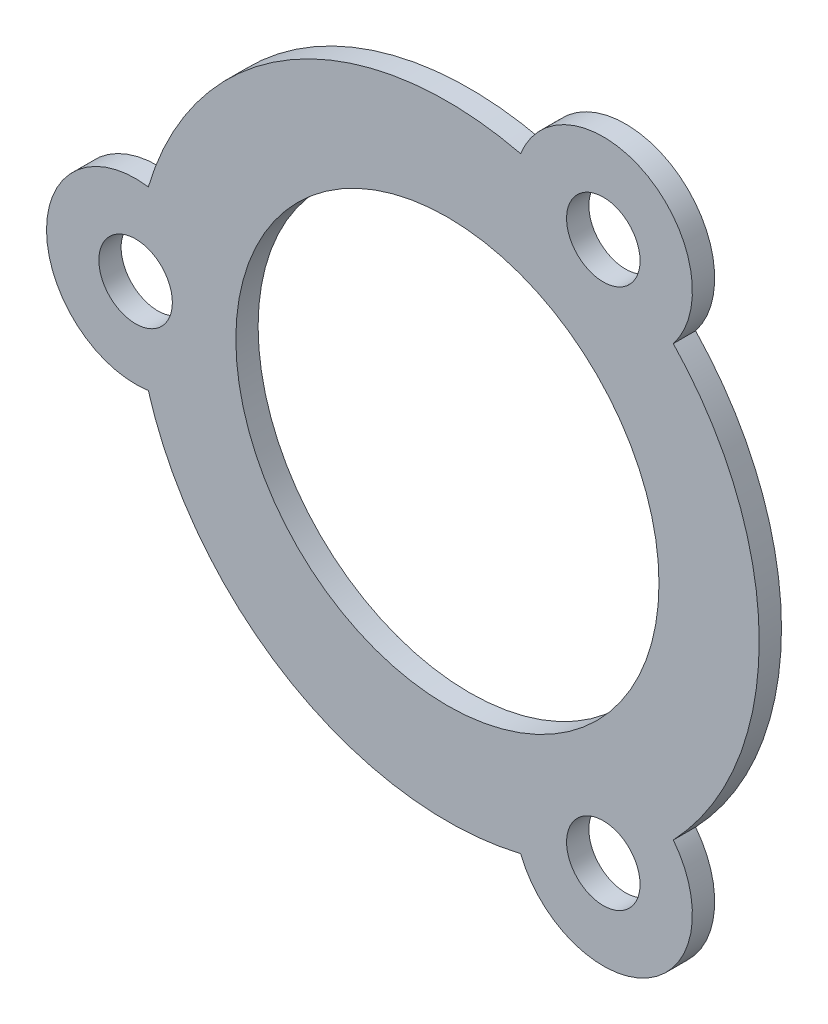
ISO-10303-21;
HEADER;
FILE_DESCRIPTION(('STEP AP214'),'2;1');
FILE_NAME('part.step','',(''),(''),'','','');
FILE_SCHEMA(('AUTOMOTIVE_DESIGN { 1 0 10303 214 1 1 1 1 }'));
ENDSEC;
DATA;
#1=APPLICATION_CONTEXT('core data for automotive mechanical design processes');
#2=APPLICATION_PROTOCOL_DEFINITION('international standard','automotive_design',2000,#1);
#3=PRODUCT_CONTEXT('',#1,'mechanical');
#4=PRODUCT('Part','Part','',(#3));
#5=PRODUCT_RELATED_PRODUCT_CATEGORY('part','',(#4));
#6=PRODUCT_DEFINITION_FORMATION('','',#4);
#7=PRODUCT_DEFINITION_CONTEXT('part definition',#1,'design');
#8=PRODUCT_DEFINITION('design','',#6,#7);
#9=PRODUCT_DEFINITION_SHAPE('','',#8);
#10=(LENGTH_UNIT() NAMED_UNIT(*) SI_UNIT(.MILLI.,.METRE.));
#11=(NAMED_UNIT(*) PLANE_ANGLE_UNIT() SI_UNIT($,.RADIAN.));
#12=(NAMED_UNIT(*) SI_UNIT($,.STERADIAN.) SOLID_ANGLE_UNIT());
#13=UNCERTAINTY_MEASURE_WITH_UNIT(LENGTH_MEASURE(1.E-05),#10,'distance_accuracy_value','');
#14=(GEOMETRIC_REPRESENTATION_CONTEXT(3) GLOBAL_UNCERTAINTY_ASSIGNED_CONTEXT((#13)) GLOBAL_UNIT_ASSIGNED_CONTEXT((#10,
#11,#12)) REPRESENTATION_CONTEXT('',''));
#15=CARTESIAN_POINT('',(0.,0.,0.));
#16=DIRECTION('',(0.,0.,1.));
#17=DIRECTION('',(1.,0.,0.));
#18=AXIS2_PLACEMENT_3D('',#15,#16,#17);
#19=CARTESIAN_POINT('',(3.50000000000007,6.06217782648983,1.));
#20=DIRECTION('',(0.,0.,1.));
#21=DIRECTION('',(1.,0.,0.));
#22=AXIS2_PLACEMENT_3D('',#19,#20,#21);
#23=PLANE('',#22);
#24=CARTESIAN_POINT('',(-14.0000000000001,-1.48579065717414E-12,1.));
#25=DIRECTION('',(0.,0.,1.));
#26=DIRECTION('',(1.,0.,0.));
#27=AXIS2_PLACEMENT_3D('',#24,#25,#26);
#28=CIRCLE('',#27,1.65);
#29=CARTESIAN_POINT('',(-12.3500000000001,-1.48579065717414E-12,1.));
#30=VERTEX_POINT('',#29);
#31=EDGE_CURVE('E193',#30,#30,#28,.T.);
#32=ORIENTED_EDGE('',*,*,#31,.F.);
#33=EDGE_LOOP('',(#32));
#34=FACE_BOUND('',#33,.T.);
#35=CARTESIAN_POINT('',(7.00000000000026,12.1243556529807,1.));
#36=DIRECTION('',(0.,0.,1.));
#37=DIRECTION('',(1.,0.,0.));
#38=AXIS2_PLACEMENT_3D('',#35,#36,#37);
#39=CIRCLE('',#38,1.65);
#40=CARTESIAN_POINT('',(8.65000000000026,12.1243556529807,1.));
#41=VERTEX_POINT('',#40);
#42=EDGE_CURVE('E126',#41,#41,#39,.T.);
#43=ORIENTED_EDGE('',*,*,#42,.F.);
#44=EDGE_LOOP('',(#43));
#45=FACE_BOUND('',#44,.T.);
#46=CARTESIAN_POINT('',(-1.15281465963681E-13,-1.07698597882384E-12,1.));
#47=DIRECTION('',(0.,0.,1.));
#48=DIRECTION('',(1.,0.,0.));
#49=AXIS2_PLACEMENT_3D('',#46,#47,#48);
#50=CIRCLE('',#49,14.);
#51=CARTESIAN_POINT('',(10.1428571428569,-9.64999735645642,1.));
#52=VERTEX_POINT('',#51);
#53=CARTESIAN_POINT('',(10.1428571428574,9.64999735645374,1.));
#54=VERTEX_POINT('',#53);
#55=EDGE_CURVE('E133',#52,#54,#50,.T.);
#56=ORIENTED_EDGE('',*,*,#55,.T.);
#57=CARTESIAN_POINT('',(7.00000000000026,12.1243556529807,1.));
#58=DIRECTION('',(0.,0.,1.));
#59=DIRECTION('',(1.,0.,0.));
#60=AXIS2_PLACEMENT_3D('',#57,#58,#59);
#61=CIRCLE('',#60,4.);
#62=CARTESIAN_POINT('',(3.28571428571463,13.6089706308971,1.));
#63=VERTEX_POINT('',#62);
#64=EDGE_CURVE('E91',#54,#63,#61,.T.);
#65=ORIENTED_EDGE('',*,*,#64,.T.);
#66=CARTESIAN_POINT('',(-1.15281465963681E-13,-1.07698597882384E-12,1.));
#67=DIRECTION('',(0.,0.,1.));
#68=DIRECTION('',(1.,0.,0.));
#69=AXIS2_PLACEMENT_3D('',#66,#67,#68);
#70=CIRCLE('',#69,14.);
#71=CARTESIAN_POINT('',(-13.4285714285717,3.95897327444167,1.));
#72=VERTEX_POINT('',#71);
#73=EDGE_CURVE('E104',#63,#72,#70,.T.);
#74=ORIENTED_EDGE('',*,*,#73,.T.);
#75=CARTESIAN_POINT('',(-14.0000000000001,-1.48599188509735E-12,1.));
#76=DIRECTION('',(0.,0.,1.));
#77=DIRECTION('',(1.,0.,0.));
#78=AXIS2_PLACEMENT_3D('',#75,#76,#77);
#79=CIRCLE('',#78,4.);
#80=CARTESIAN_POINT('',(-13.4285714285714,-3.95897327444461,1.));
#81=VERTEX_POINT('',#80);
#82=EDGE_CURVE('E98',#72,#81,#79,.T.);
#83=ORIENTED_EDGE('',*,*,#82,.T.);
#84=CARTESIAN_POINT('',(-1.15281465963681E-13,-1.07698597882384E-12,1.));
#85=DIRECTION('',(0.,0.,1.));
#86=DIRECTION('',(1.,0.,0.));
#87=AXIS2_PLACEMENT_3D('',#84,#85,#86);
#88=CIRCLE('',#87,14.);
#89=CARTESIAN_POINT('',(3.28571428571418,-13.6089706308994,1.));
#90=VERTEX_POINT('',#89);
#91=EDGE_CURVE('E102',#81,#90,#88,.T.);
#92=ORIENTED_EDGE('',*,*,#91,.T.);
#93=CARTESIAN_POINT('',(7.00000000000021,-12.124355652984,1.));
#94=DIRECTION('',(0.,0.,1.));
#95=DIRECTION('',(1.,0.,0.));
#96=AXIS2_PLACEMENT_3D('',#93,#94,#95);
#97=CIRCLE('',#96,4.);
#98=EDGE_CURVE('E54',#90,#52,#97,.T.);
#99=ORIENTED_EDGE('',*,*,#98,.T.);
#100=EDGE_LOOP('',(#56,#65,#74,#83,#92,#99));
#101=FACE_BOUND('',#100,.T.);
#102=CARTESIAN_POINT('',(7.00000000000021,-12.124355652984,1.));
#103=DIRECTION('',(0.,0.,1.));
#104=DIRECTION('',(1.,0.,0.));
#105=AXIS2_PLACEMENT_3D('',#102,#103,#104);
#106=CIRCLE('',#105,1.65);
#107=CARTESIAN_POINT('',(8.65000000000021,-12.124355652984,1.));
#108=VERTEX_POINT('',#107);
#109=EDGE_CURVE('E199',#108,#108,#106,.T.);
#110=ORIENTED_EDGE('',*,*,#109,.F.);
#111=EDGE_LOOP('',(#110));
#112=FACE_BOUND('',#111,.T.);
#113=CARTESIAN_POINT('',(-1.15975355354071E-13,-1.07587575579922E-12,1.));
#114=DIRECTION('',(0.,0.,1.));
#115=DIRECTION('',(1.,0.,0.));
#116=AXIS2_PLACEMENT_3D('',#113,#114,#115);
#117=CIRCLE('',#116,9.5);
#118=CARTESIAN_POINT('',(9.49999999999988,-1.07587575579922E-12,1.));
#119=VERTEX_POINT('',#118);
#120=EDGE_CURVE('E184',#119,#119,#117,.T.);
#121=ORIENTED_EDGE('',*,*,#120,.F.);
#122=EDGE_LOOP('',(#121));
#123=FACE_BOUND('',#122,.T.);
#124=ADVANCED_FACE('F37',(#34,#45,#101,#112,#123),#23,.T.);
#125=CARTESIAN_POINT('',(3.50000000000007,6.06217782648983,0.));
#126=DIRECTION('',(0.,0.,1.));
#127=DIRECTION('',(1.,0.,0.));
#128=AXIS2_PLACEMENT_3D('',#125,#126,#127);
#129=PLANE('',#128);
#130=CARTESIAN_POINT('',(-1.15281465963681E-13,-1.07698597882384E-12,0.));
#131=DIRECTION('',(0.,0.,1.));
#132=DIRECTION('',(1.,0.,0.));
#133=AXIS2_PLACEMENT_3D('',#130,#131,#132);
#134=CIRCLE('',#133,14.);
#135=CARTESIAN_POINT('',(10.1428571428569,-9.64999735645642,0.));
#136=VERTEX_POINT('',#135);
#137=CARTESIAN_POINT('',(10.1428571428574,9.64999735645374,0.));
#138=VERTEX_POINT('',#137);
#139=EDGE_CURVE('E122',#136,#138,#134,.T.);
#140=ORIENTED_EDGE('',*,*,#139,.F.);
#141=CARTESIAN_POINT('',(7.00000000000021,-12.124355652984,0.));
#142=DIRECTION('',(0.,0.,1.));
#143=DIRECTION('',(1.,0.,0.));
#144=AXIS2_PLACEMENT_3D('',#141,#142,#143);
#145=CIRCLE('',#144,4.);
#146=CARTESIAN_POINT('',(3.28571428571418,-13.6089706308994,0.));
#147=VERTEX_POINT('',#146);
#148=EDGE_CURVE('E83',#147,#136,#145,.T.);
#149=ORIENTED_EDGE('',*,*,#148,.F.);
#150=CARTESIAN_POINT('',(-1.15281465963681E-13,-1.07698597882384E-12,0.));
#151=DIRECTION('',(0.,0.,1.));
#152=DIRECTION('',(1.,0.,0.));
#153=AXIS2_PLACEMENT_3D('',#150,#151,#152);
#154=CIRCLE('',#153,14.);
#155=CARTESIAN_POINT('',(-13.4285714285714,-3.95897327444461,0.));
#156=VERTEX_POINT('',#155);
#157=EDGE_CURVE('E77',#156,#147,#154,.T.);
#158=ORIENTED_EDGE('',*,*,#157,.F.);
#159=CARTESIAN_POINT('',(-14.0000000000001,-1.48599188509735E-12,0.));
#160=DIRECTION('',(0.,0.,1.));
#161=DIRECTION('',(1.,0.,0.));
#162=AXIS2_PLACEMENT_3D('',#159,#160,#161);
#163=CIRCLE('',#162,4.);
#164=CARTESIAN_POINT('',(-13.4285714285717,3.95897327444167,0.));
#165=VERTEX_POINT('',#164);
#166=EDGE_CURVE('E112',#165,#156,#163,.T.);
#167=ORIENTED_EDGE('',*,*,#166,.F.);
#168=CARTESIAN_POINT('',(-1.15281465963681E-13,-1.07698597882384E-12,0.));
#169=DIRECTION('',(0.,0.,1.));
#170=DIRECTION('',(1.,0.,0.));
#171=AXIS2_PLACEMENT_3D('',#168,#169,#170);
#172=CIRCLE('',#171,14.);
#173=CARTESIAN_POINT('',(3.28571428571463,13.6089706308971,0.));
#174=VERTEX_POINT('',#173);
#175=EDGE_CURVE('E128',#174,#165,#172,.T.);
#176=ORIENTED_EDGE('',*,*,#175,.F.);
#177=CARTESIAN_POINT('',(7.00000000000026,12.1243556529807,0.));
#178=DIRECTION('',(0.,0.,1.));
#179=DIRECTION('',(1.,0.,0.));
#180=AXIS2_PLACEMENT_3D('',#177,#178,#179);
#181=CIRCLE('',#180,4.);
#182=EDGE_CURVE('E125',#138,#174,#181,.T.);
#183=ORIENTED_EDGE('',*,*,#182,.F.);
#184=EDGE_LOOP('',(#140,#149,#158,#167,#176,#183));
#185=FACE_BOUND('',#184,.T.);
#186=CARTESIAN_POINT('',(7.00000000000026,12.1243556529807,0.));
#187=DIRECTION('',(0.,0.,1.));
#188=DIRECTION('',(1.,0.,0.));
#189=AXIS2_PLACEMENT_3D('',#186,#187,#188);
#190=CIRCLE('',#189,1.65);
#191=CARTESIAN_POINT('',(8.65000000000026,12.1243556529807,0.));
#192=VERTEX_POINT('',#191);
#193=EDGE_CURVE('E202',#192,#192,#190,.T.);
#194=ORIENTED_EDGE('',*,*,#193,.T.);
#195=EDGE_LOOP('',(#194));
#196=FACE_BOUND('',#195,.T.);
#197=CARTESIAN_POINT('',(7.00000000000021,-12.124355652984,0.));
#198=DIRECTION('',(0.,0.,1.));
#199=DIRECTION('',(1.,0.,0.));
#200=AXIS2_PLACEMENT_3D('',#197,#198,#199);
#201=CIRCLE('',#200,1.65);
#202=CARTESIAN_POINT('',(8.65000000000021,-12.124355652984,0.));
#203=VERTEX_POINT('',#202);
#204=EDGE_CURVE('E196',#203,#203,#201,.T.);
#205=ORIENTED_EDGE('',*,*,#204,.T.);
#206=EDGE_LOOP('',(#205));
#207=FACE_BOUND('',#206,.T.);
#208=CARTESIAN_POINT('',(-14.0000000000001,-1.48579065717414E-12,0.));
#209=DIRECTION('',(0.,0.,1.));
#210=DIRECTION('',(1.,0.,0.));
#211=AXIS2_PLACEMENT_3D('',#208,#209,#210);
#212=CIRCLE('',#211,1.65);
#213=CARTESIAN_POINT('',(-12.3500000000001,-1.48579065717414E-12,0.));
#214=VERTEX_POINT('',#213);
#215=EDGE_CURVE('E190',#214,#214,#212,.T.);
#216=ORIENTED_EDGE('',*,*,#215,.T.);
#217=EDGE_LOOP('',(#216));
#218=FACE_BOUND('',#217,.T.);
#219=CARTESIAN_POINT('',(-1.15975355354071E-13,-1.07587575579922E-12,0.));
#220=DIRECTION('',(0.,0.,1.));
#221=DIRECTION('',(1.,0.,0.));
#222=AXIS2_PLACEMENT_3D('',#219,#220,#221);
#223=CIRCLE('',#222,9.5);
#224=CARTESIAN_POINT('',(9.49999999999988,-1.07587575579922E-12,0.));
#225=VERTEX_POINT('',#224);
#226=EDGE_CURVE('E187',#225,#225,#223,.T.);
#227=ORIENTED_EDGE('',*,*,#226,.T.);
#228=EDGE_LOOP('',(#227));
#229=FACE_BOUND('',#228,.T.);
#230=ADVANCED_FACE('F142',(#185,#196,#207,#218,#229),#129,.F.);
#231=CARTESIAN_POINT('',(-1.15281465963681E-13,-1.07698597882384E-12,1.));
#232=DIRECTION('',(0.,0.,-1.));
#233=DIRECTION('',(-1.,0.,0.));
#234=AXIS2_PLACEMENT_3D('',#231,#232,#233);
#235=CYLINDRICAL_SURFACE('',#234,14.);
#236=ORIENTED_EDGE('',*,*,#139,.T.);
#237=DIRECTION('',(0.,0.,-1.));
#238=VECTOR('',#237,1.);
#239=CARTESIAN_POINT('',(10.1428571428574,9.64999735645374,1.));
#240=LINE('',#239,#238);
#241=EDGE_CURVE('E11',#54,#138,#240,.T.);
#242=ORIENTED_EDGE('',*,*,#241,.F.);
#243=ORIENTED_EDGE('',*,*,#55,.F.);
#244=DIRECTION('',(0.,0.,-1.));
#245=VECTOR('',#244,1.);
#246=CARTESIAN_POINT('',(10.1428571428569,-9.64999735645642,1.));
#247=LINE('',#246,#245);
#248=EDGE_CURVE('E118',#52,#136,#247,.T.);
#249=ORIENTED_EDGE('',*,*,#248,.T.);
#250=EDGE_LOOP('',(#236,#242,#243,#249));
#251=FACE_BOUND('',#250,.T.);
#252=ADVANCED_FACE('F39',(#251),#235,.T.);
#253=CARTESIAN_POINT('',(7.00000000000026,12.1243556529807,1.));
#254=DIRECTION('',(0.,0.,-1.));
#255=DIRECTION('',(-1.,0.,0.));
#256=AXIS2_PLACEMENT_3D('',#253,#254,#255);
#257=CYLINDRICAL_SURFACE('',#256,4.);
#258=ORIENTED_EDGE('',*,*,#182,.T.);
#259=DIRECTION('',(0.,0.,-1.));
#260=VECTOR('',#259,1.);
#261=CARTESIAN_POINT('',(3.28571428571463,13.6089706308971,1.));
#262=LINE('',#261,#260);
#263=EDGE_CURVE('E46',#63,#174,#262,.T.);
#264=ORIENTED_EDGE('',*,*,#263,.F.);
#265=ORIENTED_EDGE('',*,*,#64,.F.);
#266=ORIENTED_EDGE('',*,*,#241,.T.);
#267=EDGE_LOOP('',(#258,#264,#265,#266));
#268=FACE_BOUND('',#267,.T.);
#269=ADVANCED_FACE('F264',(#268),#257,.T.);
#270=CARTESIAN_POINT('',(-1.15281465963681E-13,-1.07698597882384E-12,1.));
#271=DIRECTION('',(0.,0.,-1.));
#272=DIRECTION('',(-1.,0.,0.));
#273=AXIS2_PLACEMENT_3D('',#270,#271,#272);
#274=CYLINDRICAL_SURFACE('',#273,14.);
#275=ORIENTED_EDGE('',*,*,#175,.T.);
#276=DIRECTION('',(0.,0.,-1.));
#277=VECTOR('',#276,1.);
#278=CARTESIAN_POINT('',(-13.4285714285717,3.95897327444167,1.));
#279=LINE('',#278,#277);
#280=EDGE_CURVE('E113',#72,#165,#279,.T.);
#281=ORIENTED_EDGE('',*,*,#280,.F.);
#282=ORIENTED_EDGE('',*,*,#73,.F.);
#283=ORIENTED_EDGE('',*,*,#263,.T.);
#284=EDGE_LOOP('',(#275,#281,#282,#283));
#285=FACE_BOUND('',#284,.T.);
#286=ADVANCED_FACE('F139',(#285),#274,.T.);
#287=CARTESIAN_POINT('',(-14.0000000000001,-1.48599188509735E-12,1.));
#288=DIRECTION('',(0.,0.,-1.));
#289=DIRECTION('',(-1.,0.,0.));
#290=AXIS2_PLACEMENT_3D('',#287,#288,#289);
#291=CYLINDRICAL_SURFACE('',#290,4.);
#292=ORIENTED_EDGE('',*,*,#166,.T.);
#293=DIRECTION('',(0.,0.,-1.));
#294=VECTOR('',#293,1.);
#295=CARTESIAN_POINT('',(-13.4285714285714,-3.95897327444461,1.));
#296=LINE('',#295,#294);
#297=EDGE_CURVE('E109',#81,#156,#296,.T.);
#298=ORIENTED_EDGE('',*,*,#297,.F.);
#299=ORIENTED_EDGE('',*,*,#82,.F.);
#300=ORIENTED_EDGE('',*,*,#280,.T.);
#301=EDGE_LOOP('',(#292,#298,#299,#300));
#302=FACE_BOUND('',#301,.T.);
#303=ADVANCED_FACE('F110',(#302),#291,.T.);
#304=CARTESIAN_POINT('',(-1.15281465963681E-13,-1.07698597882384E-12,1.));
#305=DIRECTION('',(0.,0.,-1.));
#306=DIRECTION('',(-1.,0.,0.));
#307=AXIS2_PLACEMENT_3D('',#304,#305,#306);
#308=CYLINDRICAL_SURFACE('',#307,14.);
#309=ORIENTED_EDGE('',*,*,#157,.T.);
#310=DIRECTION('',(0.,0.,-1.));
#311=VECTOR('',#310,1.);
#312=CARTESIAN_POINT('',(3.28571428571418,-13.6089706308994,1.));
#313=LINE('',#312,#311);
#314=EDGE_CURVE('E114',#90,#147,#313,.T.);
#315=ORIENTED_EDGE('',*,*,#314,.F.);
#316=ORIENTED_EDGE('',*,*,#91,.F.);
#317=ORIENTED_EDGE('',*,*,#297,.T.);
#318=EDGE_LOOP('',(#309,#315,#316,#317));
#319=FACE_BOUND('',#318,.T.);
#320=ADVANCED_FACE('F116',(#319),#308,.T.);
#321=CARTESIAN_POINT('',(7.00000000000021,-12.124355652984,1.));
#322=DIRECTION('',(0.,0.,-1.));
#323=DIRECTION('',(-1.,0.,0.));
#324=AXIS2_PLACEMENT_3D('',#321,#322,#323);
#325=CYLINDRICAL_SURFACE('',#324,4.);
#326=ORIENTED_EDGE('',*,*,#148,.T.);
#327=ORIENTED_EDGE('',*,*,#248,.F.);
#328=ORIENTED_EDGE('',*,*,#98,.F.);
#329=ORIENTED_EDGE('',*,*,#314,.T.);
#330=EDGE_LOOP('',(#326,#327,#328,#329));
#331=FACE_BOUND('',#330,.T.);
#332=ADVANCED_FACE('F147',(#331),#325,.T.);
#333=CARTESIAN_POINT('',(7.00000000000026,12.1243556529807,1.));
#334=DIRECTION('',(0.,0.,-1.));
#335=DIRECTION('',(-1.,0.,0.));
#336=AXIS2_PLACEMENT_3D('',#333,#334,#335);
#337=CYLINDRICAL_SURFACE('',#336,1.65);
#338=ORIENTED_EDGE('',*,*,#42,.T.);
#339=EDGE_LOOP('',(#338));
#340=FACE_BOUND('',#339,.T.);
#341=ORIENTED_EDGE('',*,*,#193,.F.);
#342=EDGE_LOOP('',(#341));
#343=FACE_BOUND('',#342,.T.);
#344=ADVANCED_FACE('F149',(#340,#343),#337,.F.);
#345=CARTESIAN_POINT('',(7.00000000000021,-12.124355652984,1.));
#346=DIRECTION('',(0.,0.,-1.));
#347=DIRECTION('',(-1.,0.,0.));
#348=AXIS2_PLACEMENT_3D('',#345,#346,#347);
#349=CYLINDRICAL_SURFACE('',#348,1.65);
#350=ORIENTED_EDGE('',*,*,#109,.T.);
#351=EDGE_LOOP('',(#350));
#352=FACE_BOUND('',#351,.T.);
#353=ORIENTED_EDGE('',*,*,#204,.F.);
#354=EDGE_LOOP('',(#353));
#355=FACE_BOUND('',#354,.T.);
#356=ADVANCED_FACE('F155',(#352,#355),#349,.F.);
#357=CARTESIAN_POINT('',(-14.0000000000001,-1.48579065717414E-12,1.));
#358=DIRECTION('',(0.,0.,-1.));
#359=DIRECTION('',(-1.,0.,0.));
#360=AXIS2_PLACEMENT_3D('',#357,#358,#359);
#361=CYLINDRICAL_SURFACE('',#360,1.65);
#362=ORIENTED_EDGE('',*,*,#31,.T.);
#363=EDGE_LOOP('',(#362));
#364=FACE_BOUND('',#363,.T.);
#365=ORIENTED_EDGE('',*,*,#215,.F.);
#366=EDGE_LOOP('',(#365));
#367=FACE_BOUND('',#366,.T.);
#368=ADVANCED_FACE('F171',(#364,#367),#361,.F.);
#369=CARTESIAN_POINT('',(-1.15975355354071E-13,-1.07587575579922E-12,1.));
#370=DIRECTION('',(0.,0.,-1.));
#371=DIRECTION('',(-1.,0.,0.));
#372=AXIS2_PLACEMENT_3D('',#369,#370,#371);
#373=CYLINDRICAL_SURFACE('',#372,9.5);
#374=ORIENTED_EDGE('',*,*,#120,.T.);
#375=EDGE_LOOP('',(#374));
#376=FACE_BOUND('',#375,.T.);
#377=ORIENTED_EDGE('',*,*,#226,.F.);
#378=EDGE_LOOP('',(#377));
#379=FACE_BOUND('',#378,.T.);
#380=ADVANCED_FACE('F175',(#376,#379),#373,.F.);
#381=CLOSED_SHELL('',(#124,#230,#252,#269,#286,#303,#320,#332,#344,#356,#368,#380));
#382=MANIFOLD_SOLID_BREP('B2',#381);
#383=ADVANCED_BREP_SHAPE_REPRESENTATION('',(#18,#382),#14);
#384=SHAPE_DEFINITION_REPRESENTATION(#9,#383);
ENDSEC;
END-ISO-10303-21;
